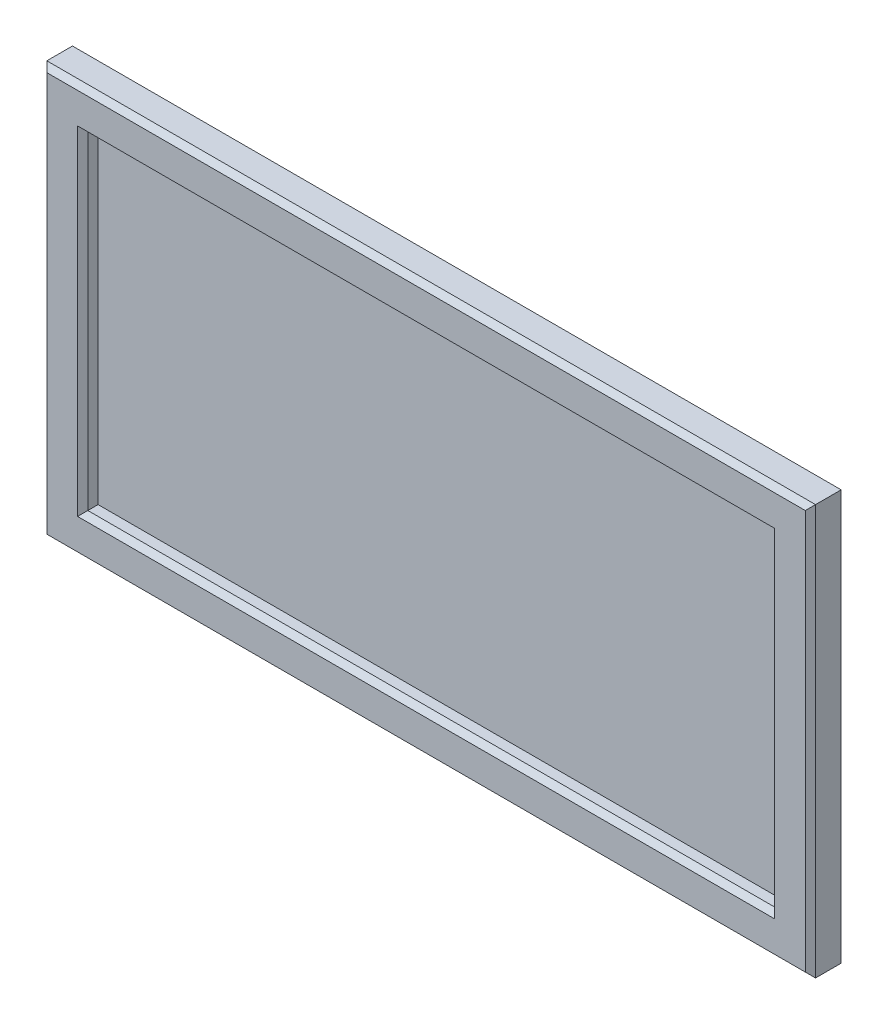
ISO-10303-21;
HEADER;
FILE_DESCRIPTION(('STEP AP214'),'2;1');
FILE_NAME('part.step','',(''),(''),'','','');
FILE_SCHEMA(('AUTOMOTIVE_DESIGN { 1 0 10303 214 1 1 1 1 }'));
ENDSEC;
DATA;
#1=APPLICATION_CONTEXT('core data for automotive mechanical design processes');
#2=APPLICATION_PROTOCOL_DEFINITION('international standard','automotive_design',2000,#1);
#3=PRODUCT_CONTEXT('',#1,'mechanical');
#4=PRODUCT('Part','Part','',(#3));
#5=PRODUCT_RELATED_PRODUCT_CATEGORY('part','',(#4));
#6=PRODUCT_DEFINITION_FORMATION('','',#4);
#7=PRODUCT_DEFINITION_CONTEXT('part definition',#1,'design');
#8=PRODUCT_DEFINITION('design','',#6,#7);
#9=PRODUCT_DEFINITION_SHAPE('','',#8);
#10=(LENGTH_UNIT() NAMED_UNIT(*) SI_UNIT(.MILLI.,.METRE.));
#11=(NAMED_UNIT(*) PLANE_ANGLE_UNIT() SI_UNIT($,.RADIAN.));
#12=(NAMED_UNIT(*) SI_UNIT($,.STERADIAN.) SOLID_ANGLE_UNIT());
#13=UNCERTAINTY_MEASURE_WITH_UNIT(LENGTH_MEASURE(1.E-05),#10,'distance_accuracy_value','');
#14=(GEOMETRIC_REPRESENTATION_CONTEXT(3) GLOBAL_UNCERTAINTY_ASSIGNED_CONTEXT((#13)) GLOBAL_UNIT_ASSIGNED_CONTEXT((#10,
#11,#12)) REPRESENTATION_CONTEXT('',''));
#15=CARTESIAN_POINT('',(0.,0.,0.));
#16=DIRECTION('',(0.,0.,1.));
#17=DIRECTION('',(1.,0.,0.));
#18=AXIS2_PLACEMENT_3D('',#15,#16,#17);
#19=CARTESIAN_POINT('',(1457.1482538956,737.874545146967,30.));
#20=DIRECTION('',(1.,0.,0.));
#21=DIRECTION('',(0.,1.,0.));
#22=AXIS2_PLACEMENT_3D('',#19,#20,#21);
#23=PLANE('',#22);
#24=DIRECTION('',(0.,-1.,0.));
#25=VECTOR('',#24,1.);
#26=CARTESIAN_POINT('',(1457.1482538956,737.874545146967,20.));
#27=LINE('',#26,#25);
#28=CARTESIAN_POINT('',(1457.1482538956,737.874545146967,20.));
#29=VERTEX_POINT('',#28);
#30=CARTESIAN_POINT('',(1457.1482538956,37.5133814701847,20.));
#31=VERTEX_POINT('',#30);
#32=EDGE_CURVE('E119',#29,#31,#27,.T.);
#33=ORIENTED_EDGE('',*,*,#32,.F.);
#34=DIRECTION('',(0.,0.,-1.));
#35=VECTOR('',#34,1.);
#36=CARTESIAN_POINT('',(1457.1482538956,737.874545146967,30.));
#37=LINE('',#36,#35);
#38=CARTESIAN_POINT('',(1457.1482538956,737.874545146967,30.));
#39=VERTEX_POINT('',#38);
#40=EDGE_CURVE('E12',#39,#29,#37,.T.);
#41=ORIENTED_EDGE('',*,*,#40,.F.);
#42=DIRECTION('',(0.,-1.,0.));
#43=VECTOR('',#42,1.);
#44=CARTESIAN_POINT('',(1457.1482538956,737.874545146967,30.));
#45=LINE('',#44,#43);
#46=CARTESIAN_POINT('',(1457.1482538956,37.5133814701847,30.));
#47=VERTEX_POINT('',#46);
#48=EDGE_CURVE('E113',#39,#47,#45,.T.);
#49=ORIENTED_EDGE('',*,*,#48,.T.);
#50=DIRECTION('',(0.,0.,-1.));
#51=VECTOR('',#50,1.);
#52=CARTESIAN_POINT('',(1457.1482538956,37.5133814701847,30.));
#53=LINE('',#52,#51);
#54=EDGE_CURVE('E58',#47,#31,#53,.T.);
#55=ORIENTED_EDGE('',*,*,#54,.T.);
#56=EDGE_LOOP('',(#33,#41,#49,#55));
#57=FACE_BOUND('',#56,.T.);
#58=ADVANCED_FACE('F55',(#57),#23,.T.);
#59=CARTESIAN_POINT('',(1457.1482538956,737.874545146967,30.));
#60=DIRECTION('',(0.,1.,0.));
#61=DIRECTION('',(0.,0.,1.));
#62=AXIS2_PLACEMENT_3D('',#59,#60,#61);
#63=PLANE('',#62);
#64=DIRECTION('',(1.,0.,0.));
#65=VECTOR('',#64,1.);
#66=CARTESIAN_POINT('',(1457.1482538956,737.874545146967,20.));
#67=LINE('',#66,#65);
#68=CARTESIAN_POINT('',(41.8597438026764,737.874545146967,20.));
#69=VERTEX_POINT('',#68);
#70=EDGE_CURVE('E115',#69,#29,#67,.T.);
#71=ORIENTED_EDGE('',*,*,#70,.F.);
#72=DIRECTION('',(0.,0.,-1.));
#73=VECTOR('',#72,1.);
#74=CARTESIAN_POINT('',(41.8597438026764,737.874545146967,30.));
#75=LINE('',#74,#73);
#76=CARTESIAN_POINT('',(41.8597438026764,737.874545146967,30.));
#77=VERTEX_POINT('',#76);
#78=EDGE_CURVE('E64',#77,#69,#75,.T.);
#79=ORIENTED_EDGE('',*,*,#78,.F.);
#80=DIRECTION('',(1.,0.,0.));
#81=VECTOR('',#80,1.);
#82=CARTESIAN_POINT('',(1457.1482538956,737.874545146967,30.));
#83=LINE('',#82,#81);
#84=EDGE_CURVE('E110',#77,#39,#83,.T.);
#85=ORIENTED_EDGE('',*,*,#84,.T.);
#86=ORIENTED_EDGE('',*,*,#40,.T.);
#87=EDGE_LOOP('',(#71,#79,#85,#86));
#88=FACE_BOUND('',#87,.T.);
#89=ADVANCED_FACE('F129',(#88),#63,.T.);
#90=CARTESIAN_POINT('',(41.8597438026764,737.874545146967,30.));
#91=DIRECTION('',(-1.,0.,0.));
#92=DIRECTION('',(0.,0.,1.));
#93=AXIS2_PLACEMENT_3D('',#90,#91,#92);
#94=PLANE('',#93);
#95=DIRECTION('',(0.,1.,0.));
#96=VECTOR('',#95,1.);
#97=CARTESIAN_POINT('',(41.8597438026764,737.874545146967,20.));
#98=LINE('',#97,#96);
#99=CARTESIAN_POINT('',(41.8597438026764,37.5133814701847,20.));
#100=VERTEX_POINT('',#99);
#101=EDGE_CURVE('E105',#100,#69,#98,.T.);
#102=ORIENTED_EDGE('',*,*,#101,.F.);
#103=DIRECTION('',(0.,0.,-1.));
#104=VECTOR('',#103,1.);
#105=CARTESIAN_POINT('',(41.8597438026764,37.5133814701847,30.));
#106=LINE('',#105,#104);
#107=CARTESIAN_POINT('',(41.8597438026764,37.5133814701847,30.));
#108=VERTEX_POINT('',#107);
#109=EDGE_CURVE('E100',#108,#100,#106,.T.);
#110=ORIENTED_EDGE('',*,*,#109,.F.);
#111=DIRECTION('',(0.,1.,0.));
#112=VECTOR('',#111,1.);
#113=CARTESIAN_POINT('',(41.8597438026764,737.874545146967,30.));
#114=LINE('',#113,#112);
#115=EDGE_CURVE('E103',#108,#77,#114,.T.);
#116=ORIENTED_EDGE('',*,*,#115,.T.);
#117=ORIENTED_EDGE('',*,*,#78,.T.);
#118=EDGE_LOOP('',(#102,#110,#116,#117));
#119=FACE_BOUND('',#118,.T.);
#120=ADVANCED_FACE('F102',(#119),#94,.T.);
#121=CARTESIAN_POINT('',(1457.1482538956,37.5133814701847,30.));
#122=DIRECTION('',(0.,-1.,0.));
#123=DIRECTION('',(0.,0.,-1.));
#124=AXIS2_PLACEMENT_3D('',#121,#122,#123);
#125=PLANE('',#124);
#126=DIRECTION('',(-1.,0.,0.));
#127=VECTOR('',#126,1.);
#128=CARTESIAN_POINT('',(1457.1482538956,37.5133814701847,20.));
#129=LINE('',#128,#127);
#130=EDGE_CURVE('E122',#31,#100,#129,.T.);
#131=ORIENTED_EDGE('',*,*,#130,.F.);
#132=ORIENTED_EDGE('',*,*,#54,.F.);
#133=DIRECTION('',(-1.,0.,0.));
#134=VECTOR('',#133,1.);
#135=CARTESIAN_POINT('',(1457.1482538956,37.5133814701847,30.));
#136=LINE('',#135,#134);
#137=EDGE_CURVE('E109',#47,#108,#136,.T.);
#138=ORIENTED_EDGE('',*,*,#137,.T.);
#139=ORIENTED_EDGE('',*,*,#109,.T.);
#140=EDGE_LOOP('',(#131,#132,#138,#139));
#141=FACE_BOUND('',#140,.T.);
#142=ADVANCED_FACE('F112',(#141),#125,.T.);
#143=CARTESIAN_POINT('',(0.,0.,30.));
#144=DIRECTION('',(0.,0.,-1.));
#145=DIRECTION('',(-1.,0.,0.));
#146=AXIS2_PLACEMENT_3D('',#143,#144,#145);
#147=PLANE('',#146);
#148=ORIENTED_EDGE('',*,*,#48,.F.);
#149=ORIENTED_EDGE('',*,*,#84,.F.);
#150=ORIENTED_EDGE('',*,*,#115,.F.);
#151=ORIENTED_EDGE('',*,*,#137,.F.);
#152=EDGE_LOOP('',(#148,#149,#150,#151));
#153=FACE_BOUND('',#152,.T.);
#154=ADVANCED_FACE('F108',(#153),#147,.F.);
#155=CARTESIAN_POINT('',(0.,0.,20.));
#156=DIRECTION('',(0.,0.,-1.));
#157=DIRECTION('',(-1.,0.,0.));
#158=AXIS2_PLACEMENT_3D('',#155,#156,#157);
#159=PLANE('',#158);
#160=ORIENTED_EDGE('',*,*,#32,.T.);
#161=ORIENTED_EDGE('',*,*,#130,.T.);
#162=ORIENTED_EDGE('',*,*,#101,.T.);
#163=ORIENTED_EDGE('',*,*,#70,.T.);
#164=EDGE_LOOP('',(#160,#161,#162,#163));
#165=FACE_BOUND('',#164,.T.);
#166=ADVANCED_FACE('F128',(#165),#159,.T.);
#167=CLOSED_SHELL('',(#58,#89,#120,#142,#154,#166));
#168=MANIFOLD_SOLID_BREP('B2',#167);
#169=CARTESIAN_POINT('',(0.,0.,60.));
#170=DIRECTION('',(0.,0.,-1.));
#171=DIRECTION('',(-1.,0.,0.));
#172=AXIS2_PLACEMENT_3D('',#169,#170,#171);
#173=PLANE('',#172);
#174=DIRECTION('',(1.,0.,0.));
#175=VECTOR('',#174,1.);
#176=CARTESIAN_POINT('',(1420.,730.,60.));
#177=LINE('',#176,#175);
#178=CARTESIAN_POINT('',(70.,730.,60.));
#179=VERTEX_POINT('',#178);
#180=CARTESIAN_POINT('',(1430.,730.,60.));
#181=VERTEX_POINT('',#180);
#182=EDGE_CURVE('E344',#179,#181,#177,.T.);
#183=ORIENTED_EDGE('',*,*,#182,.T.);
#184=DIRECTION('',(0.,-1.,0.));
#185=VECTOR('',#184,1.);
#186=CARTESIAN_POINT('',(1430.,80.,60.));
#187=LINE('',#186,#185);
#188=CARTESIAN_POINT('',(1430.,70.,60.));
#189=VERTEX_POINT('',#188);
#190=EDGE_CURVE('E346',#181,#189,#187,.T.);
#191=ORIENTED_EDGE('',*,*,#190,.T.);
#192=DIRECTION('',(-1.,0.,0.));
#193=VECTOR('',#192,1.);
#194=CARTESIAN_POINT('',(80.,70.,60.));
#195=LINE('',#194,#193);
#196=CARTESIAN_POINT('',(70.,70.,60.));
#197=VERTEX_POINT('',#196);
#198=EDGE_CURVE('E340',#189,#197,#195,.T.);
#199=ORIENTED_EDGE('',*,*,#198,.T.);
#200=DIRECTION('',(0.,1.,0.));
#201=VECTOR('',#200,1.);
#202=CARTESIAN_POINT('',(70.,720.,60.));
#203=LINE('',#202,#201);
#204=EDGE_CURVE('E342',#197,#179,#203,.T.);
#205=ORIENTED_EDGE('',*,*,#204,.T.);
#206=EDGE_LOOP('',(#183,#191,#199,#205));
#207=FACE_BOUND('',#206,.T.);
#208=DIRECTION('',(0.,1.,0.));
#209=VECTOR('',#208,1.);
#210=CARTESIAN_POINT('',(1490.,0.,60.));
#211=LINE('',#210,#209);
#212=CARTESIAN_POINT('',(1490.,9.99999999999978,60.));
#213=VERTEX_POINT('',#212);
#214=CARTESIAN_POINT('',(1490.,790.,60.));
#215=VERTEX_POINT('',#214);
#216=EDGE_CURVE('E335',#213,#215,#211,.T.);
#217=ORIENTED_EDGE('',*,*,#216,.T.);
#218=DIRECTION('',(-1.,0.,0.));
#219=VECTOR('',#218,1.);
#220=CARTESIAN_POINT('',(0.,790.,60.));
#221=LINE('',#220,#219);
#222=CARTESIAN_POINT('',(9.99999999999978,790.,60.));
#223=VERTEX_POINT('',#222);
#224=EDGE_CURVE('E337',#215,#223,#221,.T.);
#225=ORIENTED_EDGE('',*,*,#224,.T.);
#226=DIRECTION('',(0.,-1.,0.));
#227=VECTOR('',#226,1.);
#228=CARTESIAN_POINT('',(9.99999999999978,0.,60.));
#229=LINE('',#228,#227);
#230=CARTESIAN_POINT('',(9.99999999999978,9.99999999999978,60.));
#231=VERTEX_POINT('',#230);
#232=EDGE_CURVE('E331',#223,#231,#229,.T.);
#233=ORIENTED_EDGE('',*,*,#232,.T.);
#234=DIRECTION('',(1.,0.,0.));
#235=VECTOR('',#234,1.);
#236=CARTESIAN_POINT('',(0.,9.99999999999978,60.));
#237=LINE('',#236,#235);
#238=EDGE_CURVE('E333',#231,#213,#237,.T.);
#239=ORIENTED_EDGE('',*,*,#238,.T.);
#240=EDGE_LOOP('',(#217,#225,#233,#239));
#241=FACE_BOUND('',#240,.T.);
#242=ADVANCED_FACE('F179',(#207,#241),#173,.F.);
#243=CARTESIAN_POINT('',(0.,0.,0.));
#244=DIRECTION('',(0.,0.,-1.));
#245=DIRECTION('',(-1.,0.,0.));
#246=AXIS2_PLACEMENT_3D('',#243,#244,#245);
#247=PLANE('',#246);
#248=DIRECTION('',(0.,-1.,0.));
#249=VECTOR('',#248,1.);
#250=CARTESIAN_POINT('',(0.,0.,0.));
#251=LINE('',#250,#249);
#252=CARTESIAN_POINT('',(0.,800.,0.));
#253=VERTEX_POINT('',#252);
#254=CARTESIAN_POINT('',(0.,0.,0.));
#255=VERTEX_POINT('',#254);
#256=EDGE_CURVE('E282',#253,#255,#251,.T.);
#257=ORIENTED_EDGE('',*,*,#256,.F.);
#258=DIRECTION('',(-1.,0.,0.));
#259=VECTOR('',#258,1.);
#260=CARTESIAN_POINT('',(0.,800.,0.));
#261=LINE('',#260,#259);
#262=CARTESIAN_POINT('',(1500.,800.,0.));
#263=VERTEX_POINT('',#262);
#264=EDGE_CURVE('E318',#263,#253,#261,.T.);
#265=ORIENTED_EDGE('',*,*,#264,.F.);
#266=DIRECTION('',(0.,1.,0.));
#267=VECTOR('',#266,1.);
#268=CARTESIAN_POINT('',(1500.,0.,0.));
#269=LINE('',#268,#267);
#270=CARTESIAN_POINT('',(1500.,0.,0.));
#271=VERTEX_POINT('',#270);
#272=EDGE_CURVE('E315',#271,#263,#269,.T.);
#273=ORIENTED_EDGE('',*,*,#272,.F.);
#274=DIRECTION('',(1.,0.,0.));
#275=VECTOR('',#274,1.);
#276=CARTESIAN_POINT('',(0.,0.,0.));
#277=LINE('',#276,#275);
#278=EDGE_CURVE('E312',#255,#271,#277,.T.);
#279=ORIENTED_EDGE('',*,*,#278,.F.);
#280=EDGE_LOOP('',(#257,#265,#273,#279));
#281=FACE_BOUND('',#280,.T.);
#282=DIRECTION('',(0.,-1.,0.));
#283=VECTOR('',#282,1.);
#284=CARTESIAN_POINT('',(80.,80.,0.));
#285=LINE('',#284,#283);
#286=CARTESIAN_POINT('',(80.,720.,0.));
#287=VERTEX_POINT('',#286);
#288=CARTESIAN_POINT('',(80.,80.,0.));
#289=VERTEX_POINT('',#288);
#290=EDGE_CURVE('E296',#287,#289,#285,.T.);
#291=ORIENTED_EDGE('',*,*,#290,.T.);
#292=DIRECTION('',(1.,0.,0.));
#293=VECTOR('',#292,1.);
#294=CARTESIAN_POINT('',(80.,80.,0.));
#295=LINE('',#294,#293);
#296=CARTESIAN_POINT('',(1420.,80.,0.));
#297=VERTEX_POINT('',#296);
#298=EDGE_CURVE('E275',#289,#297,#295,.T.);
#299=ORIENTED_EDGE('',*,*,#298,.T.);
#300=DIRECTION('',(0.,1.,0.));
#301=VECTOR('',#300,1.);
#302=CARTESIAN_POINT('',(1420.,80.,0.));
#303=LINE('',#302,#301);
#304=CARTESIAN_POINT('',(1420.,720.,0.));
#305=VERTEX_POINT('',#304);
#306=EDGE_CURVE('E286',#297,#305,#303,.T.);
#307=ORIENTED_EDGE('',*,*,#306,.T.);
#308=DIRECTION('',(-1.,0.,0.));
#309=VECTOR('',#308,1.);
#310=CARTESIAN_POINT('',(80.,720.,0.));
#311=LINE('',#310,#309);
#312=EDGE_CURVE('E292',#305,#287,#311,.T.);
#313=ORIENTED_EDGE('',*,*,#312,.T.);
#314=EDGE_LOOP('',(#291,#299,#307,#313));
#315=FACE_BOUND('',#314,.T.);
#316=ADVANCED_FACE('F294',(#281,#315),#247,.T.);
#317=CARTESIAN_POINT('',(0.,0.,60.));
#318=DIRECTION('',(1.,0.,0.));
#319=DIRECTION('',(0.,0.,-1.));
#320=AXIS2_PLACEMENT_3D('',#317,#318,#319);
#321=PLANE('',#320);
#322=DIRECTION('',(0.,0.,-1.));
#323=VECTOR('',#322,1.);
#324=CARTESIAN_POINT('',(0.,0.,60.));
#325=LINE('',#324,#323);
#326=CARTESIAN_POINT('',(0.,0.,50.));
#327=VERTEX_POINT('',#326);
#328=EDGE_CURVE('E327',#327,#255,#325,.T.);
#329=ORIENTED_EDGE('',*,*,#328,.F.);
#330=DIRECTION('',(0.,1.,0.));
#331=VECTOR('',#330,1.);
#332=CARTESIAN_POINT('',(0.,0.,50.));
#333=LINE('',#332,#331);
#334=CARTESIAN_POINT('',(0.,800.,50.));
#335=VERTEX_POINT('',#334);
#336=EDGE_CURVE('E53',#327,#335,#333,.T.);
#337=ORIENTED_EDGE('',*,*,#336,.T.);
#338=DIRECTION('',(0.,0.,-1.));
#339=VECTOR('',#338,1.);
#340=CARTESIAN_POINT('',(0.,800.,60.));
#341=LINE('',#340,#339);
#342=EDGE_CURVE('E321',#335,#253,#341,.T.);
#343=ORIENTED_EDGE('',*,*,#342,.T.);
#344=ORIENTED_EDGE('',*,*,#256,.T.);
#345=EDGE_LOOP('',(#329,#337,#343,#344));
#346=FACE_BOUND('',#345,.T.);
#347=ADVANCED_FACE('F386',(#346),#321,.F.);
#348=CARTESIAN_POINT('',(0.,0.,60.));
#349=DIRECTION('',(0.,1.,0.));
#350=DIRECTION('',(0.,0.,1.));
#351=AXIS2_PLACEMENT_3D('',#348,#349,#350);
#352=PLANE('',#351);
#353=DIRECTION('',(0.,0.,-1.));
#354=VECTOR('',#353,1.);
#355=CARTESIAN_POINT('',(1500.,0.,60.));
#356=LINE('',#355,#354);
#357=CARTESIAN_POINT('',(1500.,0.,50.));
#358=VERTEX_POINT('',#357);
#359=EDGE_CURVE('E325',#358,#271,#356,.T.);
#360=ORIENTED_EDGE('',*,*,#359,.F.);
#361=DIRECTION('',(-1.,0.,0.));
#362=VECTOR('',#361,1.);
#363=CARTESIAN_POINT('',(0.,0.,50.));
#364=LINE('',#363,#362);
#365=EDGE_CURVE('E189',#358,#327,#364,.T.);
#366=ORIENTED_EDGE('',*,*,#365,.T.);
#367=ORIENTED_EDGE('',*,*,#328,.T.);
#368=ORIENTED_EDGE('',*,*,#278,.T.);
#369=EDGE_LOOP('',(#360,#366,#367,#368));
#370=FACE_BOUND('',#369,.T.);
#371=ADVANCED_FACE('F413',(#370),#352,.F.);
#372=CARTESIAN_POINT('',(1500.,0.,60.));
#373=DIRECTION('',(-1.,0.,0.));
#374=DIRECTION('',(0.,0.,1.));
#375=AXIS2_PLACEMENT_3D('',#372,#373,#374);
#376=PLANE('',#375);
#377=DIRECTION('',(0.,0.,-1.));
#378=VECTOR('',#377,1.);
#379=CARTESIAN_POINT('',(1500.,800.,60.));
#380=LINE('',#379,#378);
#381=CARTESIAN_POINT('',(1500.,800.,50.));
#382=VERTEX_POINT('',#381);
#383=EDGE_CURVE('E323',#382,#263,#380,.T.);
#384=ORIENTED_EDGE('',*,*,#383,.F.);
#385=DIRECTION('',(0.,-1.,0.));
#386=VECTOR('',#385,1.);
#387=CARTESIAN_POINT('',(1500.,0.,50.));
#388=LINE('',#387,#386);
#389=EDGE_CURVE('E204',#382,#358,#388,.T.);
#390=ORIENTED_EDGE('',*,*,#389,.T.);
#391=ORIENTED_EDGE('',*,*,#359,.T.);
#392=ORIENTED_EDGE('',*,*,#272,.T.);
#393=EDGE_LOOP('',(#384,#390,#391,#392));
#394=FACE_BOUND('',#393,.T.);
#395=ADVANCED_FACE('F410',(#394),#376,.F.);
#396=CARTESIAN_POINT('',(0.,800.,60.));
#397=DIRECTION('',(0.,-1.,0.));
#398=DIRECTION('',(0.,0.,-1.));
#399=AXIS2_PLACEMENT_3D('',#396,#397,#398);
#400=PLANE('',#399);
#401=ORIENTED_EDGE('',*,*,#342,.F.);
#402=DIRECTION('',(1.,0.,0.));
#403=VECTOR('',#402,1.);
#404=CARTESIAN_POINT('',(0.,800.,50.));
#405=LINE('',#404,#403);
#406=EDGE_CURVE('E354',#335,#382,#405,.T.);
#407=ORIENTED_EDGE('',*,*,#406,.T.);
#408=ORIENTED_EDGE('',*,*,#383,.T.);
#409=ORIENTED_EDGE('',*,*,#264,.T.);
#410=EDGE_LOOP('',(#401,#407,#408,#409));
#411=FACE_BOUND('',#410,.T.);
#412=ADVANCED_FACE('F389',(#411),#400,.F.);
#413=CARTESIAN_POINT('',(80.,80.,60.));
#414=DIRECTION('',(0.,1.,0.));
#415=DIRECTION('',(0.,0.,1.));
#416=AXIS2_PLACEMENT_3D('',#413,#414,#415);
#417=PLANE('',#416);
#418=DIRECTION('',(0.,0.,-1.));
#419=VECTOR('',#418,1.);
#420=CARTESIAN_POINT('',(80.,80.,60.));
#421=LINE('',#420,#419);
#422=CARTESIAN_POINT('',(80.,80.,50.0000000000002));
#423=VERTEX_POINT('',#422);
#424=EDGE_CURVE('E305',#423,#289,#421,.T.);
#425=ORIENTED_EDGE('',*,*,#424,.F.);
#426=DIRECTION('',(1.,0.,0.));
#427=VECTOR('',#426,1.);
#428=CARTESIAN_POINT('',(1420.,80.,50.0000000000002));
#429=LINE('',#428,#427);
#430=CARTESIAN_POINT('',(1420.,80.,50.0000000000002));
#431=VERTEX_POINT('',#430);
#432=EDGE_CURVE('E278',#423,#431,#429,.T.);
#433=ORIENTED_EDGE('',*,*,#432,.T.);
#434=DIRECTION('',(0.,0.,-1.));
#435=VECTOR('',#434,1.);
#436=CARTESIAN_POINT('',(1420.,80.,60.));
#437=LINE('',#436,#435);
#438=EDGE_CURVE('E270',#431,#297,#437,.T.);
#439=ORIENTED_EDGE('',*,*,#438,.T.);
#440=ORIENTED_EDGE('',*,*,#298,.F.);
#441=EDGE_LOOP('',(#425,#433,#439,#440));
#442=FACE_BOUND('',#441,.T.);
#443=ADVANCED_FACE('F273',(#442),#417,.T.);
#444=CARTESIAN_POINT('',(1420.,80.,60.));
#445=DIRECTION('',(-1.,0.,0.));
#446=DIRECTION('',(0.,0.,1.));
#447=AXIS2_PLACEMENT_3D('',#444,#445,#446);
#448=PLANE('',#447);
#449=ORIENTED_EDGE('',*,*,#438,.F.);
#450=DIRECTION('',(0.,1.,0.));
#451=VECTOR('',#450,1.);
#452=CARTESIAN_POINT('',(1420.,720.,50.0000000000002));
#453=LINE('',#452,#451);
#454=CARTESIAN_POINT('',(1420.,720.,50.0000000000002));
#455=VERTEX_POINT('',#454);
#456=EDGE_CURVE('E329',#431,#455,#453,.T.);
#457=ORIENTED_EDGE('',*,*,#456,.T.);
#458=DIRECTION('',(0.,0.,-1.));
#459=VECTOR('',#458,1.);
#460=CARTESIAN_POINT('',(1420.,720.,60.));
#461=LINE('',#460,#459);
#462=EDGE_CURVE('E283',#455,#305,#461,.T.);
#463=ORIENTED_EDGE('',*,*,#462,.T.);
#464=ORIENTED_EDGE('',*,*,#306,.F.);
#465=EDGE_LOOP('',(#449,#457,#463,#464));
#466=FACE_BOUND('',#465,.T.);
#467=ADVANCED_FACE('F287',(#466),#448,.T.);
#468=CARTESIAN_POINT('',(80.,720.,60.));
#469=DIRECTION('',(0.,-1.,0.));
#470=DIRECTION('',(0.,0.,-1.));
#471=AXIS2_PLACEMENT_3D('',#468,#469,#470);
#472=PLANE('',#471);
#473=ORIENTED_EDGE('',*,*,#462,.F.);
#474=DIRECTION('',(-1.,0.,0.));
#475=VECTOR('',#474,1.);
#476=CARTESIAN_POINT('',(80.,720.,50.0000000000002));
#477=LINE('',#476,#475);
#478=CARTESIAN_POINT('',(80.,720.,50.0000000000002));
#479=VERTEX_POINT('',#478);
#480=EDGE_CURVE('E349',#455,#479,#477,.T.);
#481=ORIENTED_EDGE('',*,*,#480,.T.);
#482=DIRECTION('',(0.,0.,-1.));
#483=VECTOR('',#482,1.);
#484=CARTESIAN_POINT('',(80.,720.,60.));
#485=LINE('',#484,#483);
#486=EDGE_CURVE('E307',#479,#287,#485,.T.);
#487=ORIENTED_EDGE('',*,*,#486,.T.);
#488=ORIENTED_EDGE('',*,*,#312,.F.);
#489=EDGE_LOOP('',(#473,#481,#487,#488));
#490=FACE_BOUND('',#489,.T.);
#491=ADVANCED_FACE('F491',(#490),#472,.T.);
#492=CARTESIAN_POINT('',(80.,80.,60.));
#493=DIRECTION('',(1.,0.,0.));
#494=DIRECTION('',(0.,0.,-1.));
#495=AXIS2_PLACEMENT_3D('',#492,#493,#494);
#496=PLANE('',#495);
#497=ORIENTED_EDGE('',*,*,#486,.F.);
#498=DIRECTION('',(0.,-1.,0.));
#499=VECTOR('',#498,1.);
#500=CARTESIAN_POINT('',(80.,80.,50.0000000000002));
#501=LINE('',#500,#499);
#502=EDGE_CURVE('E351',#479,#423,#501,.T.);
#503=ORIENTED_EDGE('',*,*,#502,.T.);
#504=ORIENTED_EDGE('',*,*,#424,.T.);
#505=ORIENTED_EDGE('',*,*,#290,.F.);
#506=EDGE_LOOP('',(#497,#503,#504,#505));
#507=FACE_BOUND('',#506,.T.);
#508=ADVANCED_FACE('F444',(#507),#496,.T.);
#509=CARTESIAN_POINT('',(80.,80.,50.0000000000002));
#510=DIRECTION('',(0.70710678118654,0.,0.707106781186555));
#511=DIRECTION('',(0.,1.,0.));
#512=AXIS2_PLACEMENT_3D('',#509,#510,#511);
#513=PLANE('',#512);
#514=DIRECTION('',(-0.57735026918963,0.57735026918963,0.577350269189617));
#515=VECTOR('',#514,1.);
#516=CARTESIAN_POINT('',(80.,720.,50.0000000000002));
#517=LINE('',#516,#515);
#518=EDGE_CURVE('E300',#179,#479,#517,.F.);
#519=ORIENTED_EDGE('',*,*,#518,.F.);
#520=ORIENTED_EDGE('',*,*,#204,.F.);
#521=DIRECTION('',(-0.57735026918963,-0.57735026918963,0.577350269189617));
#522=VECTOR('',#521,1.);
#523=CARTESIAN_POINT('',(80.,80.,50.0000000000002));
#524=LINE('',#523,#522);
#525=EDGE_CURVE('E297',#423,#197,#524,.T.);
#526=ORIENTED_EDGE('',*,*,#525,.F.);
#527=ORIENTED_EDGE('',*,*,#502,.F.);
#528=EDGE_LOOP('',(#519,#520,#526,#527));
#529=FACE_BOUND('',#528,.T.);
#530=ADVANCED_FACE('F438',(#529),#513,.T.);
#531=CARTESIAN_POINT('',(80.,80.,50.0000000000002));
#532=DIRECTION('',(0.,0.70710678118654,0.707106781186555));
#533=DIRECTION('',(-1.,0.,0.));
#534=AXIS2_PLACEMENT_3D('',#531,#532,#533);
#535=PLANE('',#534);
#536=ORIENTED_EDGE('',*,*,#525,.T.);
#537=ORIENTED_EDGE('',*,*,#198,.F.);
#538=DIRECTION('',(-0.57735026918963,0.57735026918963,-0.577350269189617));
#539=VECTOR('',#538,1.);
#540=CARTESIAN_POINT('',(1420.,80.,50.0000000000002));
#541=LINE('',#540,#539);
#542=EDGE_CURVE('E361',#431,#189,#541,.F.);
#543=ORIENTED_EDGE('',*,*,#542,.F.);
#544=ORIENTED_EDGE('',*,*,#432,.F.);
#545=EDGE_LOOP('',(#536,#537,#543,#544));
#546=FACE_BOUND('',#545,.T.);
#547=ADVANCED_FACE('F431',(#546),#535,.T.);
#548=CARTESIAN_POINT('',(80.,720.,50.0000000000002));
#549=DIRECTION('',(0.,-0.70710678118654,0.707106781186555));
#550=DIRECTION('',(1.,0.,0.));
#551=AXIS2_PLACEMENT_3D('',#548,#549,#550);
#552=PLANE('',#551);
#553=ORIENTED_EDGE('',*,*,#518,.T.);
#554=ORIENTED_EDGE('',*,*,#480,.F.);
#555=DIRECTION('',(0.57735026918963,0.57735026918963,0.577350269189617));
#556=VECTOR('',#555,1.);
#557=CARTESIAN_POINT('',(1206.66666666666,506.666666666664,-163.333333333332));
#558=LINE('',#557,#556);
#559=EDGE_CURVE('E359',#181,#455,#558,.F.);
#560=ORIENTED_EDGE('',*,*,#559,.F.);
#561=ORIENTED_EDGE('',*,*,#182,.F.);
#562=EDGE_LOOP('',(#553,#554,#560,#561));
#563=FACE_BOUND('',#562,.T.);
#564=ADVANCED_FACE('F424',(#563),#552,.T.);
#565=CARTESIAN_POINT('',(1420.,80.,50.0000000000002));
#566=DIRECTION('',(-0.70710678118654,0.,0.707106781186555));
#567=DIRECTION('',(0.,-1.,0.));
#568=AXIS2_PLACEMENT_3D('',#565,#566,#567);
#569=PLANE('',#568);
#570=ORIENTED_EDGE('',*,*,#542,.T.);
#571=ORIENTED_EDGE('',*,*,#190,.F.);
#572=ORIENTED_EDGE('',*,*,#559,.T.);
#573=ORIENTED_EDGE('',*,*,#456,.F.);
#574=EDGE_LOOP('',(#570,#571,#572,#573));
#575=FACE_BOUND('',#574,.T.);
#576=ADVANCED_FACE('F418',(#575),#569,.T.);
#577=CARTESIAN_POINT('',(0.,9.99999999999978,60.));
#578=DIRECTION('',(0.,0.707106781186556,-0.707106781186539));
#579=DIRECTION('',(1.,0.,0.));
#580=AXIS2_PLACEMENT_3D('',#577,#578,#579);
#581=PLANE('',#580);
#582=DIRECTION('',(0.577350269189621,0.577350269189621,0.577350269189635));
#583=VECTOR('',#582,1.);
#584=CARTESIAN_POINT('',(6.66666666666657,6.66666666666657,56.6666666666667));
#585=LINE('',#584,#583);
#586=EDGE_CURVE('E368',#327,#231,#585,.T.);
#587=ORIENTED_EDGE('',*,*,#586,.F.);
#588=ORIENTED_EDGE('',*,*,#365,.F.);
#589=DIRECTION('',(-0.577350269189622,0.577350269189621,0.577350269189634));
#590=VECTOR('',#589,1.);
#591=CARTESIAN_POINT('',(993.333333333341,506.666666666659,556.666666666671));
#592=LINE('',#591,#590);
#593=EDGE_CURVE('E184',#213,#358,#592,.F.);
#594=ORIENTED_EDGE('',*,*,#593,.F.);
#595=ORIENTED_EDGE('',*,*,#238,.F.);
#596=EDGE_LOOP('',(#587,#588,#594,#595));
#597=FACE_BOUND('',#596,.T.);
#598=ADVANCED_FACE('F182',(#597),#581,.F.);
#599=CARTESIAN_POINT('',(1490.,0.,60.));
#600=DIRECTION('',(-0.707106781186555,0.,-0.70710678118654));
#601=DIRECTION('',(0.,1.,0.));
#602=AXIS2_PLACEMENT_3D('',#599,#600,#601);
#603=PLANE('',#602);
#604=ORIENTED_EDGE('',*,*,#593,.T.);
#605=ORIENTED_EDGE('',*,*,#389,.F.);
#606=DIRECTION('',(-0.577350269189622,-0.577350269189622,0.577350269189634));
#607=VECTOR('',#606,1.);
#608=CARTESIAN_POINT('',(1226.66666666667,526.666666666671,323.333333333335));
#609=LINE('',#608,#607);
#610=EDGE_CURVE('E367',#215,#382,#609,.F.);
#611=ORIENTED_EDGE('',*,*,#610,.F.);
#612=ORIENTED_EDGE('',*,*,#216,.F.);
#613=EDGE_LOOP('',(#604,#605,#611,#612));
#614=FACE_BOUND('',#613,.T.);
#615=ADVANCED_FACE('F378',(#614),#603,.F.);
#616=CARTESIAN_POINT('',(9.99999999999978,0.,60.));
#617=DIRECTION('',(0.707106781186556,0.,-0.707106781186539));
#618=DIRECTION('',(0.,-1.,0.));
#619=AXIS2_PLACEMENT_3D('',#616,#617,#618);
#620=PLANE('',#619);
#621=ORIENTED_EDGE('',*,*,#586,.T.);
#622=ORIENTED_EDGE('',*,*,#232,.F.);
#623=DIRECTION('',(-0.577350269189621,0.577350269189622,-0.577350269189634));
#624=VECTOR('',#623,1.);
#625=CARTESIAN_POINT('',(273.333333333329,526.66666666667,323.333333333335));
#626=LINE('',#625,#624);
#627=EDGE_CURVE('E365',#335,#223,#626,.F.);
#628=ORIENTED_EDGE('',*,*,#627,.F.);
#629=ORIENTED_EDGE('',*,*,#336,.F.);
#630=EDGE_LOOP('',(#621,#622,#628,#629));
#631=FACE_BOUND('',#630,.T.);
#632=ADVANCED_FACE('F383',(#631),#620,.F.);
#633=CARTESIAN_POINT('',(0.,790.,60.));
#634=DIRECTION('',(0.,-0.707106781186555,-0.70710678118654));
#635=DIRECTION('',(-1.,0.,0.));
#636=AXIS2_PLACEMENT_3D('',#633,#634,#635);
#637=PLANE('',#636);
#638=ORIENTED_EDGE('',*,*,#610,.T.);
#639=ORIENTED_EDGE('',*,*,#406,.F.);
#640=ORIENTED_EDGE('',*,*,#627,.T.);
#641=ORIENTED_EDGE('',*,*,#224,.F.);
#642=EDGE_LOOP('',(#638,#639,#640,#641));
#643=FACE_BOUND('',#642,.T.);
#644=ADVANCED_FACE('F393',(#643),#637,.F.);
#645=CLOSED_SHELL('',(#242,#316,#347,#371,#395,#412,#443,#467,#491,#508,#530,#547,#564,#576,
#598,#615,#632,#644));
#646=MANIFOLD_SOLID_BREP('B6',#645);
#647=ADVANCED_BREP_SHAPE_REPRESENTATION('',(#18,#168,#646),#14);
#648=SHAPE_DEFINITION_REPRESENTATION(#9,#647);
ENDSEC;
END-ISO-10303-21;
